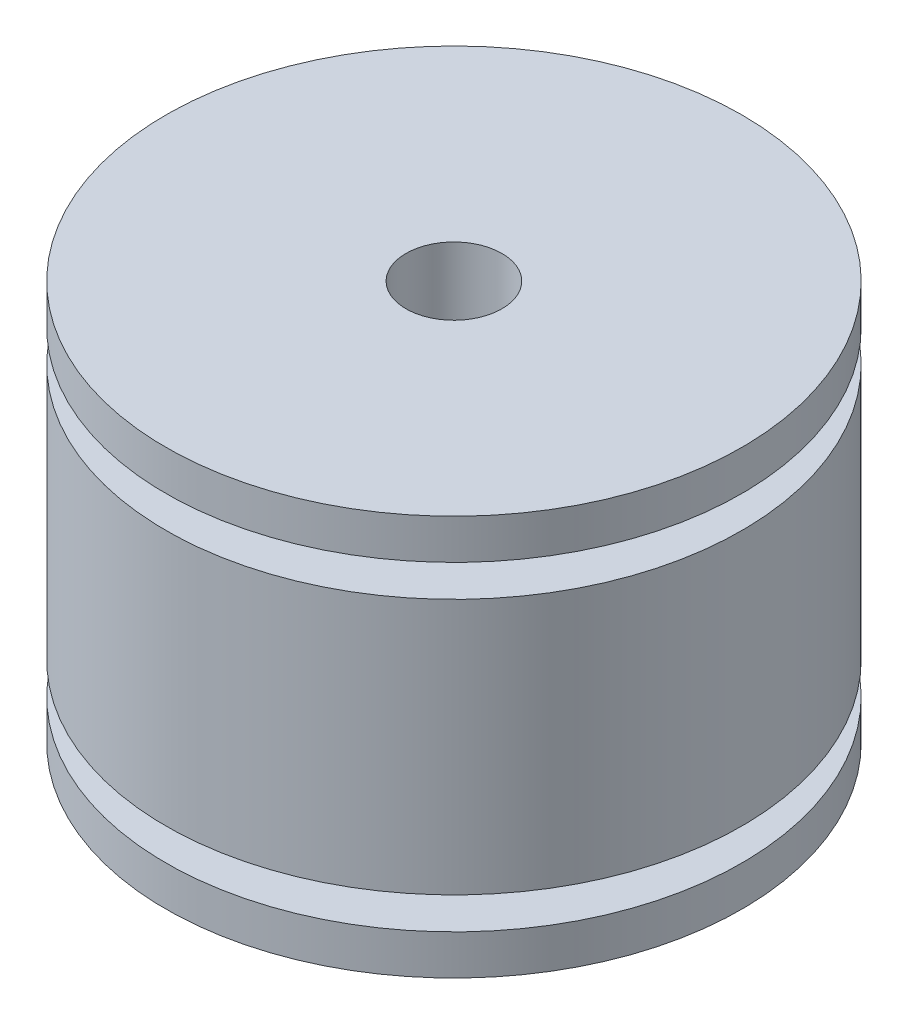
ISO-10303-21;
HEADER;
FILE_DESCRIPTION(('STEP AP214'),'2;1');
FILE_NAME('part.step','',(''),(''),'','','');
FILE_SCHEMA(('AUTOMOTIVE_DESIGN { 1 0 10303 214 1 1 1 1 }'));
ENDSEC;
DATA;
#1=APPLICATION_CONTEXT('core data for automotive mechanical design processes');
#2=APPLICATION_PROTOCOL_DEFINITION('international standard','automotive_design',2000,#1);
#3=PRODUCT_CONTEXT('',#1,'mechanical');
#4=PRODUCT('Part','Part','',(#3));
#5=PRODUCT_RELATED_PRODUCT_CATEGORY('part','',(#4));
#6=PRODUCT_DEFINITION_FORMATION('','',#4);
#7=PRODUCT_DEFINITION_CONTEXT('part definition',#1,'design');
#8=PRODUCT_DEFINITION('design','',#6,#7);
#9=PRODUCT_DEFINITION_SHAPE('','',#8);
#10=(LENGTH_UNIT() NAMED_UNIT(*) SI_UNIT(.MILLI.,.METRE.));
#11=(NAMED_UNIT(*) PLANE_ANGLE_UNIT() SI_UNIT($,.RADIAN.));
#12=(NAMED_UNIT(*) SI_UNIT($,.STERADIAN.) SOLID_ANGLE_UNIT());
#13=UNCERTAINTY_MEASURE_WITH_UNIT(LENGTH_MEASURE(1.E-05),#10,'distance_accuracy_value','');
#14=(GEOMETRIC_REPRESENTATION_CONTEXT(3) GLOBAL_UNCERTAINTY_ASSIGNED_CONTEXT((#13)) GLOBAL_UNIT_ASSIGNED_CONTEXT((#10,
#11,#12)) REPRESENTATION_CONTEXT('',''));
#15=CARTESIAN_POINT('',(0.,0.,0.));
#16=DIRECTION('',(0.,0.,1.));
#17=DIRECTION('',(1.,0.,0.));
#18=AXIS2_PLACEMENT_3D('',#15,#16,#17);
#19=CARTESIAN_POINT('',(10.,0.,0.));
#20=DIRECTION('',(0.,-1.,0.));
#21=DIRECTION('',(0.,0.,-1.));
#22=AXIS2_PLACEMENT_3D('',#19,#20,#21);
#23=PLANE('',#22);
#24=CARTESIAN_POINT('',(0.,0.,0.));
#25=DIRECTION('',(0.,-1.,0.));
#26=DIRECTION('',(0.,0.,-1.));
#27=AXIS2_PLACEMENT_3D('',#24,#25,#26);
#28=CIRCLE('',#27,18.);
#29=CARTESIAN_POINT('',(0.,0.,-18.));
#30=VERTEX_POINT('',#29);
#31=EDGE_CURVE('E10',#30,#30,#28,.T.);
#32=ORIENTED_EDGE('',*,*,#31,.T.);
#33=EDGE_LOOP('',(#32));
#34=FACE_BOUND('',#33,.T.);
#35=CARTESIAN_POINT('',(0.,0.,0.));
#36=DIRECTION('',(0.,-1.,0.));
#37=DIRECTION('',(0.,0.,-1.));
#38=AXIS2_PLACEMENT_3D('',#35,#36,#37);
#39=CIRCLE('',#38,3.);
#40=CARTESIAN_POINT('',(0.,0.,-3.));
#41=VERTEX_POINT('',#40);
#42=EDGE_CURVE('E76',#41,#41,#39,.T.);
#43=ORIENTED_EDGE('',*,*,#42,.F.);
#44=EDGE_LOOP('',(#43));
#45=FACE_BOUND('',#44,.T.);
#46=ADVANCED_FACE('F31',(#34,#45),#23,.T.);
#47=CARTESIAN_POINT('',(0.,0.,0.));
#48=DIRECTION('',(0.,-1.,0.));
#49=DIRECTION('',(0.,0.,-1.));
#50=AXIS2_PLACEMENT_3D('',#47,#48,#49);
#51=CYLINDRICAL_SURFACE('',#50,18.);
#52=CARTESIAN_POINT('',(0.,2.5,0.));
#53=DIRECTION('',(0.,-1.,0.));
#54=DIRECTION('',(0.,0.,-1.));
#55=AXIS2_PLACEMENT_3D('',#52,#53,#54);
#56=CIRCLE('',#55,18.);
#57=CARTESIAN_POINT('',(0.,2.5,-18.));
#58=VERTEX_POINT('',#57);
#59=EDGE_CURVE('E43',#58,#58,#56,.T.);
#60=ORIENTED_EDGE('',*,*,#59,.T.);
#61=EDGE_LOOP('',(#60));
#62=FACE_BOUND('',#61,.T.);
#63=ORIENTED_EDGE('',*,*,#31,.F.);
#64=EDGE_LOOP('',(#63));
#65=FACE_BOUND('',#64,.T.);
#66=ADVANCED_FACE('F124',(#62,#65),#51,.T.);
#67=CARTESIAN_POINT('',(18.,2.5,0.));
#68=DIRECTION('',(0.,1.,0.));
#69=DIRECTION('',(0.,0.,1.));
#70=AXIS2_PLACEMENT_3D('',#67,#68,#69);
#71=PLANE('',#70);
#72=CARTESIAN_POINT('',(0.,2.5,0.));
#73=DIRECTION('',(0.,-1.,0.));
#74=DIRECTION('',(0.,0.,-1.));
#75=AXIS2_PLACEMENT_3D('',#72,#73,#74);
#76=CIRCLE('',#75,15.);
#77=CARTESIAN_POINT('',(0.,2.5,-15.));
#78=VERTEX_POINT('',#77);
#79=EDGE_CURVE('E47',#78,#78,#76,.T.);
#80=ORIENTED_EDGE('',*,*,#79,.T.);
#81=EDGE_LOOP('',(#80));
#82=FACE_BOUND('',#81,.T.);
#83=ORIENTED_EDGE('',*,*,#59,.F.);
#84=EDGE_LOOP('',(#83));
#85=FACE_BOUND('',#84,.T.);
#86=ADVANCED_FACE('F128',(#82,#85),#71,.T.);
#87=CARTESIAN_POINT('',(0.,0.,0.));
#88=DIRECTION('',(0.,-1.,0.));
#89=DIRECTION('',(0.,0.,-1.));
#90=AXIS2_PLACEMENT_3D('',#87,#88,#89);
#91=CYLINDRICAL_SURFACE('',#90,15.);
#92=CARTESIAN_POINT('',(0.,4.5,0.));
#93=DIRECTION('',(0.,-1.,0.));
#94=DIRECTION('',(0.,0.,-1.));
#95=AXIS2_PLACEMENT_3D('',#92,#93,#94);
#96=CIRCLE('',#95,15.);
#97=CARTESIAN_POINT('',(0.,4.5,-15.));
#98=VERTEX_POINT('',#97);
#99=EDGE_CURVE('E52',#98,#98,#96,.T.);
#100=ORIENTED_EDGE('',*,*,#99,.T.);
#101=EDGE_LOOP('',(#100));
#102=FACE_BOUND('',#101,.T.);
#103=ORIENTED_EDGE('',*,*,#79,.F.);
#104=EDGE_LOOP('',(#103));
#105=FACE_BOUND('',#104,.T.);
#106=ADVANCED_FACE('F146',(#102,#105),#91,.T.);
#107=CARTESIAN_POINT('',(15.,4.5,0.));
#108=DIRECTION('',(0.,-1.,0.));
#109=DIRECTION('',(0.,0.,-1.));
#110=AXIS2_PLACEMENT_3D('',#107,#108,#109);
#111=PLANE('',#110);
#112=CARTESIAN_POINT('',(0.,4.5,0.));
#113=DIRECTION('',(0.,-1.,0.));
#114=DIRECTION('',(0.,0.,-1.));
#115=AXIS2_PLACEMENT_3D('',#112,#113,#114);
#116=CIRCLE('',#115,18.);
#117=CARTESIAN_POINT('',(0.,4.5,-18.));
#118=VERTEX_POINT('',#117);
#119=EDGE_CURVE('E55',#118,#118,#116,.T.);
#120=ORIENTED_EDGE('',*,*,#119,.T.);
#121=EDGE_LOOP('',(#120));
#122=FACE_BOUND('',#121,.T.);
#123=ORIENTED_EDGE('',*,*,#99,.F.);
#124=EDGE_LOOP('',(#123));
#125=FACE_BOUND('',#124,.T.);
#126=ADVANCED_FACE('F120',(#122,#125),#111,.T.);
#127=CARTESIAN_POINT('',(0.,0.,0.));
#128=DIRECTION('',(0.,-1.,0.));
#129=DIRECTION('',(0.,0.,-1.));
#130=AXIS2_PLACEMENT_3D('',#127,#128,#129);
#131=CYLINDRICAL_SURFACE('',#130,18.);
#132=CARTESIAN_POINT('',(0.,14.15,-18.));
#133=CARTESIAN_POINT('',(0.0924730089777942,14.1499959769229,-17.9999990165203));
#134=CARTESIAN_POINT('',(0.185008104730828,14.1421999689901,-17.9992798102664));
#135=CARTESIAN_POINT('',(0.367515566690616,14.1112163313321,-17.9964799073167));
#136=CARTESIAN_POINT('',(0.457484950248261,14.0880114932179,-17.9943976884625));
#137=CARTESIAN_POINT('',(0.632191476383594,14.0268890336256,-17.9891069391612));
#138=CARTESIAN_POINT('',(0.716931641484837,13.9889800053683,-17.9858990666574));
#139=CARTESIAN_POINT('',(0.878826742100969,13.8995412739189,-17.9787162542032));
#140=CARTESIAN_POINT('',(0.955983240991005,13.8480143861664,-17.974741472854));
#141=CARTESIAN_POINT('',(1.10077560657444,13.7326334206667,-17.9664569369258));
#142=CARTESIAN_POINT('',(1.16838511785454,13.6687463293758,-17.9621463041436));
#143=CARTESIAN_POINT('',(1.29193798854142,13.5305285993611,-17.9536832174252));
#144=CARTESIAN_POINT('',(1.34788082274475,13.4561974907268,-17.949530770617));
#145=CARTESIAN_POINT('',(1.44660370199867,13.2990393214029,-17.9418450219315));
#146=CARTESIAN_POINT('',(1.48936022711766,13.2161974270791,-17.9383128311575));
#147=CARTESIAN_POINT('',(1.56034658154229,13.0444723874368,-17.9322780253021));
#148=CARTESIAN_POINT('',(1.58857671610169,12.9555893691094,-17.9297753885862));
#149=CARTESIAN_POINT('',(1.62963160964261,12.7745717373105,-17.9260907305027));
#150=CARTESIAN_POINT('',(1.64249971968177,12.6824470327677,-17.9249049935563));
#151=CARTESIAN_POINT('',(1.65259924969731,12.4973383448704,-17.9239767574574));
#152=CARTESIAN_POINT('',(1.64983101916567,12.4043543807678,-17.9242342260474));
#153=CARTESIAN_POINT('',(1.62877222799281,12.2204645629944,-17.9261599247296));
#154=CARTESIAN_POINT('',(1.61052888543495,12.129553250739,-17.9278238633078));
#155=CARTESIAN_POINT('',(1.5591111435692,11.9520883842742,-17.9323683015302));
#156=CARTESIAN_POINT('',(1.52593657166761,11.8655348804506,-17.9352488152371));
#157=CARTESIAN_POINT('',(1.44554556512932,11.699092718202,-17.9419067839707));
#158=CARTESIAN_POINT('',(1.39830805841616,11.6192142934759,-17.9456855832753));
#159=CARTESIAN_POINT('',(1.29114724803043,11.468501691361,-17.9537131604606));
#160=CARTESIAN_POINT('',(1.23122363277873,11.3976677361788,-17.9579619498833));
#161=CARTESIAN_POINT('',(1.1001273129707,11.266780319895,-17.9664698862705));
#162=CARTESIAN_POINT('',(1.02891380778703,11.2067677156597,-17.9707290133932));
#163=CARTESIAN_POINT('',(0.877401221334841,11.0995428052532,-17.9787628190883));
#164=CARTESIAN_POINT('',(0.79710213218257,11.0523305101894,-17.9825374972404));
#165=CARTESIAN_POINT('',(0.629670380868843,10.972048513261,-17.9891780608739));
#166=CARTESIAN_POINT('',(0.54253678551895,10.9389807466924,-17.9920438219807));
#167=CARTESIAN_POINT('',(0.363922165797386,10.8879557226478,-17.9965423154456));
#168=CARTESIAN_POINT('',(0.272441250685663,10.8699980856251,-17.998175078775));
#169=CARTESIAN_POINT('',(0.0880827863778501,10.8497545867551,-18.0000196334979));
#170=CARTESIAN_POINT('',(-0.00478851994213631,10.8474123170602,-18.0002365393753));
#171=CARTESIAN_POINT('',(-0.189602426343213,10.8583180886282,-17.9992386256883));
#172=CARTESIAN_POINT('',(-0.281545036924917,10.8715659534166,-17.9980238223304));
#173=CARTESIAN_POINT('',(-0.461729859832482,10.9132291616272,-17.9943023380432));
#174=CARTESIAN_POINT('',(-0.549978197199529,10.9416182322862,-17.9917978951337));
#175=CARTESIAN_POINT('',(-0.720459473285441,11.0127310777251,-17.9857782895889));
#176=CARTESIAN_POINT('',(-0.802692297702625,11.0554551247998,-17.9822631077548));
#177=CARTESIAN_POINT('',(-0.95906416907009,11.1541660084034,-17.9746029160205));
#178=CARTESIAN_POINT('',(-1.03317963196582,11.2101900669848,-17.9704561504294));
#179=CARTESIAN_POINT('',(-1.1709745314144,11.333857078405,-17.9620041665241));
#180=CARTESIAN_POINT('',(-1.23465374831271,11.4015002757338,-17.957698944877));
#181=CARTESIAN_POINT('',(-1.34996315741374,11.5467308468094,-17.949400012585));
#182=CARTESIAN_POINT('',(-1.40155643872762,11.6243475905938,-17.9454072803958));
#183=CARTESIAN_POINT('',(-1.49097603562296,11.7871764464673,-17.9381997831991));
#184=CARTESIAN_POINT('',(-1.52880251317026,11.8723884691836,-17.9349850090391));
#185=CARTESIAN_POINT('',(-1.58955238811465,12.0478602957559,-17.9297032329055));
#186=CARTESIAN_POINT('',(-1.61249807785267,12.1381123280263,-17.92763451475));
#187=CARTESIAN_POINT('',(-1.64290749640671,12.3212079635485,-17.9248735504127));
#188=CARTESIAN_POINT('',(-1.65037159227185,12.414051505306,-17.9241812715973));
#189=CARTESIAN_POINT('',(-1.64960130290758,12.5993278408646,-17.9242521515633));
#190=CARTESIAN_POINT('',(-1.6414249053268,12.6917608833087,-17.9250099341974));
#191=CARTESIAN_POINT('',(-1.60972696209246,12.8739347371242,-17.9278841128356));
#192=CARTESIAN_POINT('',(-1.5862053957551,12.9636755448666,-17.930000510671));
#193=CARTESIAN_POINT('',(-1.52450013860204,13.1379192438524,-17.9353520050897));
#194=CARTESIAN_POINT('',(-1.48631781481989,13.2224226226037,-17.9385869973675));
#195=CARTESIAN_POINT('',(-1.39638110313423,13.3838298321565,-17.9458113807868));
#196=CARTESIAN_POINT('',(-1.34462686256732,13.4607337454452,-17.9498007637386));
#197=CARTESIAN_POINT('',(-1.22879741420244,13.6050560796418,-17.9581020915792));
#198=CARTESIAN_POINT('',(-1.1646791015938,13.6724398430915,-17.9624151317202));
#199=CARTESIAN_POINT('',(-1.02602387521056,13.7955189222297,-17.9708677751142));
#200=CARTESIAN_POINT('',(-0.951484456637272,13.8512114197515,-17.9750073363584));
#201=CARTESIAN_POINT('',(-0.793930194119728,13.9494184651077,-17.9826556537042));
#202=CARTESIAN_POINT('',(-0.710897299477316,13.9919041380394,-17.9861630206682));
#203=CARTESIAN_POINT('',(-0.538899037117384,14.0622748268118,-17.9921361218513));
#204=CARTESIAN_POINT('',(-0.449940557540237,14.0901764729629,-17.9946030418795));
#205=CARTESIAN_POINT('',(-0.300389365833146,14.1235518796562,-17.9975903967111));
#206=CARTESIAN_POINT('',(-0.240755770046248,14.133456567057,-17.9984898367725));
#207=CARTESIAN_POINT('',(-0.120756941332191,14.1466819299447,-17.9996949585704));
#208=CARTESIAN_POINT('',(-0.0603917108432152,14.1500026273667,-18.0000006422849));
#209=CARTESIAN_POINT('',(0.,14.15,-18.));
#210=B_SPLINE_CURVE_WITH_KNOTS('',3,(#132,#133,#134,#135,#136,#137,#138,#139,#140,#141,#142,
#143,#144,#145,#146,#147,#148,#149,#150,#151,#152,#153,#154,#155,#156,#157,#158,#159,#160,#161,
#162,#163,#164,#165,#166,#167,#168,#169,#170,#171,#172,#173,#174,#175,#176,#177,#178,#179,#180,
#181,#182,#183,#184,#185,#186,#187,#188,#189,#190,#191,#192,#193,#194,#195,#196,#197,#198,#199,
#200,#201,#202,#203,#204,#205,#206,#207,#208,#209),.UNSPECIFIED.,.T.,.F.,(4,2,2,2,2,2,2,2,2,2,2,
2,2,2,2,2,2,2,2,2,2,2,2,2,2,2,2,2,2,2,2,2,2,2,2,2,2,2,4),(0.,0.277198515960827,
0.554707125579579,0.832053801183602,1.10934318123555,1.38738367666351,1.66543668605063,
1.94398281762033,2.22252309565563,2.50027547125709,2.77802163876646,3.05492337540341,
3.33182831289695,3.60915027463479,3.88647904837219,4.16483392192147,4.44318903700727,
4.72158222528574,4.99996842048417,5.27734844563559,5.55472533097676,5.83162247508419,
6.10852487919072,6.38621156637364,6.66390409735454,6.94243396559235,7.22096055683259,
7.49906892823084,7.77717070595404,8.05424341017449,8.33131648786286,8.60836373630959,
8.88540797725864,9.16343613340507,9.44153123116746,9.72023013724703,9.99861054303657,
10.1796422687253,10.3606733912888),.UNSPECIFIED.);
#211=CARTESIAN_POINT('',(0.,14.15,-18.));
#212=VERTEX_POINT('',#211);
#213=EDGE_CURVE('E79',#212,#212,#210,.T.);
#214=ORIENTED_EDGE('',*,*,#213,.F.);
#215=EDGE_LOOP('',(#214));
#216=FACE_BOUND('',#215,.T.);
#217=CARTESIAN_POINT('',(0.,20.5,0.));
#218=DIRECTION('',(0.,-1.,0.));
#219=DIRECTION('',(0.,0.,-1.));
#220=AXIS2_PLACEMENT_3D('',#217,#218,#219);
#221=CIRCLE('',#220,18.);
#222=CARTESIAN_POINT('',(0.,20.5,-18.));
#223=VERTEX_POINT('',#222);
#224=EDGE_CURVE('E58',#223,#223,#221,.T.);
#225=ORIENTED_EDGE('',*,*,#224,.T.);
#226=EDGE_LOOP('',(#225));
#227=FACE_BOUND('',#226,.T.);
#228=ORIENTED_EDGE('',*,*,#119,.F.);
#229=EDGE_LOOP('',(#228));
#230=FACE_BOUND('',#229,.T.);
#231=ADVANCED_FACE('F85',(#216,#227,#230),#131,.T.);
#232=CARTESIAN_POINT('',(18.,20.5,0.));
#233=DIRECTION('',(0.,1.,0.));
#234=DIRECTION('',(0.,0.,1.));
#235=AXIS2_PLACEMENT_3D('',#232,#233,#234);
#236=PLANE('',#235);
#237=CARTESIAN_POINT('',(0.,20.5,0.));
#238=DIRECTION('',(0.,-1.,0.));
#239=DIRECTION('',(0.,0.,-1.));
#240=AXIS2_PLACEMENT_3D('',#237,#238,#239);
#241=CIRCLE('',#240,15.);
#242=CARTESIAN_POINT('',(0.,20.5,-15.));
#243=VERTEX_POINT('',#242);
#244=EDGE_CURVE('E61',#243,#243,#241,.T.);
#245=ORIENTED_EDGE('',*,*,#244,.T.);
#246=EDGE_LOOP('',(#245));
#247=FACE_BOUND('',#246,.T.);
#248=ORIENTED_EDGE('',*,*,#224,.F.);
#249=EDGE_LOOP('',(#248));
#250=FACE_BOUND('',#249,.T.);
#251=ADVANCED_FACE('F113',(#247,#250),#236,.T.);
#252=CARTESIAN_POINT('',(0.,0.,0.));
#253=DIRECTION('',(0.,-1.,0.));
#254=DIRECTION('',(0.,0.,-1.));
#255=AXIS2_PLACEMENT_3D('',#252,#253,#254);
#256=CYLINDRICAL_SURFACE('',#255,15.);
#257=CARTESIAN_POINT('',(0.,22.5,0.));
#258=DIRECTION('',(0.,-1.,0.));
#259=DIRECTION('',(0.,0.,-1.));
#260=AXIS2_PLACEMENT_3D('',#257,#258,#259);
#261=CIRCLE('',#260,15.);
#262=CARTESIAN_POINT('',(0.,22.5,-15.));
#263=VERTEX_POINT('',#262);
#264=EDGE_CURVE('E64',#263,#263,#261,.T.);
#265=ORIENTED_EDGE('',*,*,#264,.T.);
#266=EDGE_LOOP('',(#265));
#267=FACE_BOUND('',#266,.T.);
#268=ORIENTED_EDGE('',*,*,#244,.F.);
#269=EDGE_LOOP('',(#268));
#270=FACE_BOUND('',#269,.T.);
#271=ADVANCED_FACE('F110',(#267,#270),#256,.T.);
#272=CARTESIAN_POINT('',(15.,22.5,0.));
#273=DIRECTION('',(0.,-1.,0.));
#274=DIRECTION('',(0.,0.,-1.));
#275=AXIS2_PLACEMENT_3D('',#272,#273,#274);
#276=PLANE('',#275);
#277=CARTESIAN_POINT('',(0.,22.5,0.));
#278=DIRECTION('',(0.,-1.,0.));
#279=DIRECTION('',(0.,0.,-1.));
#280=AXIS2_PLACEMENT_3D('',#277,#278,#279);
#281=CIRCLE('',#280,18.);
#282=CARTESIAN_POINT('',(0.,22.5,-18.));
#283=VERTEX_POINT('',#282);
#284=EDGE_CURVE('E67',#283,#283,#281,.T.);
#285=ORIENTED_EDGE('',*,*,#284,.T.);
#286=EDGE_LOOP('',(#285));
#287=FACE_BOUND('',#286,.T.);
#288=ORIENTED_EDGE('',*,*,#264,.F.);
#289=EDGE_LOOP('',(#288));
#290=FACE_BOUND('',#289,.T.);
#291=ADVANCED_FACE('F106',(#287,#290),#276,.T.);
#292=CARTESIAN_POINT('',(0.,0.,0.));
#293=DIRECTION('',(0.,-1.,0.));
#294=DIRECTION('',(0.,0.,-1.));
#295=AXIS2_PLACEMENT_3D('',#292,#293,#294);
#296=CYLINDRICAL_SURFACE('',#295,18.);
#297=CARTESIAN_POINT('',(0.,25.,0.));
#298=DIRECTION('',(0.,-1.,0.));
#299=DIRECTION('',(0.,0.,-1.));
#300=AXIS2_PLACEMENT_3D('',#297,#298,#299);
#301=CIRCLE('',#300,18.);
#302=CARTESIAN_POINT('',(0.,25.,-18.));
#303=VERTEX_POINT('',#302);
#304=EDGE_CURVE('E70',#303,#303,#301,.T.);
#305=ORIENTED_EDGE('',*,*,#304,.T.);
#306=EDGE_LOOP('',(#305));
#307=FACE_BOUND('',#306,.T.);
#308=ORIENTED_EDGE('',*,*,#284,.F.);
#309=EDGE_LOOP('',(#308));
#310=FACE_BOUND('',#309,.T.);
#311=ADVANCED_FACE('F102',(#307,#310),#296,.T.);
#312=CARTESIAN_POINT('',(18.,25.,0.));
#313=DIRECTION('',(0.,1.,0.));
#314=DIRECTION('',(0.,0.,1.));
#315=AXIS2_PLACEMENT_3D('',#312,#313,#314);
#316=PLANE('',#315);
#317=CARTESIAN_POINT('',(0.,25.,0.));
#318=DIRECTION('',(0.,-1.,0.));
#319=DIRECTION('',(0.,0.,-1.));
#320=AXIS2_PLACEMENT_3D('',#317,#318,#319);
#321=CIRCLE('',#320,3.);
#322=CARTESIAN_POINT('',(0.,25.,-3.));
#323=VERTEX_POINT('',#322);
#324=EDGE_CURVE('E73',#323,#323,#321,.T.);
#325=ORIENTED_EDGE('',*,*,#324,.T.);
#326=EDGE_LOOP('',(#325));
#327=FACE_BOUND('',#326,.T.);
#328=ORIENTED_EDGE('',*,*,#304,.F.);
#329=EDGE_LOOP('',(#328));
#330=FACE_BOUND('',#329,.T.);
#331=ADVANCED_FACE('F98',(#327,#330),#316,.T.);
#332=CARTESIAN_POINT('',(0.,0.,0.));
#333=DIRECTION('',(0.,-1.,0.));
#334=DIRECTION('',(0.,0.,-1.));
#335=AXIS2_PLACEMENT_3D('',#332,#333,#334);
#336=CYLINDRICAL_SURFACE('',#335,3.);
#337=CARTESIAN_POINT('',(0.,14.15,-3.));
#338=CARTESIAN_POINT('',(-0.0856699475452996,14.1499946166217,-2.99999513886583));
#339=CARTESIAN_POINT('',(-0.171409071205646,14.143289354409,-2.99629302255545));
#340=CARTESIAN_POINT('',(-0.340286051726048,14.1167977847696,-2.9818478399119));
#341=CARTESIAN_POINT('',(-0.423420195379861,14.096993621652,-2.97109516282084));
#342=CARTESIAN_POINT('',(-0.584401577928638,14.0453455356783,-2.9436571869529));
#343=CARTESIAN_POINT('',(-0.66226906266742,14.0135512213703,-2.92699634956489));
#344=CARTESIAN_POINT('',(-0.811408240635764,13.9391213318261,-2.8892116252981));
#345=CARTESIAN_POINT('',(-0.882679651896675,13.8964852934199,-2.86808754775153));
#346=CARTESIAN_POINT('',(-1.02211619357275,13.7982846668754,-2.82153252993505));
#347=CARTESIAN_POINT('',(-1.08973037342791,13.7420324755559,-2.79590528013301));
#348=CARTESIAN_POINT('',(-1.21508634233517,13.6197083915399,-2.74375354722835));
#349=CARTESIAN_POINT('',(-1.2728189023456,13.5536274256305,-2.71722825277821));
#350=CARTESIAN_POINT('',(-1.38251917690996,13.4057740140773,-2.66321895829991));
#351=CARTESIAN_POINT('',(-1.43335857713387,13.3230970385153,-2.635897965792));
#352=CARTESIAN_POINT('',(-1.52021547735939,13.1487726343674,-2.58678336476683));
#353=CARTESIAN_POINT('',(-1.5562446891168,13.0571323651428,-2.56498539395023));
#354=CARTESIAN_POINT('',(-1.60989890926138,12.8732305515727,-2.53163475086558));
#355=CARTESIAN_POINT('',(-1.62854263347079,12.7813738465472,-2.51952192354843));
#356=CARTESIAN_POINT('',(-1.64991120631134,12.5951105514433,-2.5055890563389));
#357=CARTESIAN_POINT('',(-1.65265887915297,12.500707812976,-2.50375425894471));
#358=CARTESIAN_POINT('',(-1.64290000078864,12.3275716432504,-2.51015646726158));
#359=CARTESIAN_POINT('',(-1.63265157443424,12.2486402415007,-2.51690299364892));
#360=CARTESIAN_POINT('',(-1.60118639026894,12.0938705800967,-2.53703527550373));
#361=CARTESIAN_POINT('',(-1.5799646365691,12.0180337463059,-2.55042405491467));
#362=CARTESIAN_POINT('',(-1.52687641342515,11.8695176799991,-2.58256130946142));
#363=CARTESIAN_POINT('',(-1.49479033069661,11.7969417622077,-2.60141910516922));
#364=CARTESIAN_POINT('',(-1.42107429999088,11.6578289794032,-2.64240902469132));
#365=CARTESIAN_POINT('',(-1.37944023253661,11.5912947384181,-2.66454256035721));
#366=CARTESIAN_POINT('',(-1.28018349411555,11.4551052164199,-2.71379040847906));
#367=CARTESIAN_POINT('',(-1.22107458392543,11.3866139481156,-2.74113957142577));
#368=CARTESIAN_POINT('',(-1.09224532196501,11.2599734193486,-2.79497377887706));
#369=CARTESIAN_POINT('',(-1.02251777065964,11.2018312341076,-2.82145822218593));
#370=CARTESIAN_POINT('',(-0.868605041800935,11.0937851733166,-2.87272134052732));
#371=CARTESIAN_POINT('',(-0.783763861453041,11.0446953593711,-2.89726648156192));
#372=CARTESIAN_POINT('',(-0.605352377645231,10.9619192465625,-2.93971528365153));
#373=CARTESIAN_POINT('',(-0.511790381195992,10.9282184658333,-2.95762518579738));
#374=CARTESIAN_POINT('',(-0.327907037980977,10.8803877895618,-2.98333345624201));
#375=CARTESIAN_POINT('',(-0.238095480523288,10.8647274484825,-2.99191822782612));
#376=CARTESIAN_POINT('',(-0.0567325334425125,10.8484691712931,-3.00083376662002));
#377=CARTESIAN_POINT('',(0.0348177069344353,10.8478616100382,-3.00116980828416));
#378=CARTESIAN_POINT('',(0.207487375150858,10.8610345133055,-2.99394177831786));
#379=CARTESIAN_POINT('',(0.28875177623744,10.8734146012818,-2.98714659587173));
#380=CARTESIAN_POINT('',(0.447838849624849,10.9098425973326,-2.96746793830126));
#381=CARTESIAN_POINT('',(0.525661172937912,10.9338916855665,-2.95458384737082));
#382=CARTESIAN_POINT('',(0.677753407865904,10.9933576159517,-2.92349378037743));
#383=CARTESIAN_POINT('',(0.751904240945378,11.0290176955469,-2.90517475144826));
#384=CARTESIAN_POINT('',(0.893363199749704,11.1103713462997,-2.86484215103297));
#385=CARTESIAN_POINT('',(0.960668811424108,11.1560685844836,-2.8428272299655));
#386=CARTESIAN_POINT('',(1.09455456288909,11.2620447141384,-2.79420331593949));
#387=CARTESIAN_POINT('',(1.16021004375818,11.323383283659,-2.76735592347542));
#388=CARTESIAN_POINT('',(1.28079913012788,11.4559244296775,-2.71365440736755));
#389=CARTESIAN_POINT('',(1.33572155748717,11.5271371592824,-2.6868003055646));
#390=CARTESIAN_POINT('',(1.43747254066661,11.6841641934071,-2.63385875511374));
#391=CARTESIAN_POINT('',(1.48334076829298,11.7706830768754,-2.60799295737883));
#392=CARTESIAN_POINT('',(1.55942876653783,11.9519940797087,-2.56323063992907));
#393=CARTESIAN_POINT('',(1.58967133039468,12.0467739113999,-2.54432398053561));
#394=CARTESIAN_POINT('',(1.6306246255404,12.2322623775855,-2.51825420457375));
#395=CARTESIAN_POINT('',(1.64294477567078,12.3224747805395,-2.51013022153208));
#396=CARTESIAN_POINT('',(1.65249034912289,12.504010469288,-2.50386093509844));
#397=CARTESIAN_POINT('',(1.64972872967261,12.5953327342726,-2.50570706604924));
#398=CARTESIAN_POINT('',(1.63075691736925,12.7632195215555,-2.51807870697285));
#399=CARTESIAN_POINT('',(1.61642825416935,12.8401009735331,-2.52738874118223));
#400=CARTESIAN_POINT('',(1.57741079979876,12.99019541896,-2.55192145753237));
#401=CARTESIAN_POINT('',(1.55271775279779,13.0634068916,-2.56714656833463));
#402=CARTESIAN_POINT('',(1.492056117962,13.209139646293,-2.60289749299613));
#403=CARTESIAN_POINT('',(1.45548954002739,13.2813439958992,-2.62369085726804));
#404=CARTESIAN_POINT('',(1.37268509596929,13.4190760215003,-2.66794671801683));
#405=CARTESIAN_POINT('',(1.32644209751913,13.4846001267867,-2.69141062791391));
#406=CARTESIAN_POINT('',(1.21715006880685,13.6178497395553,-2.74276036037727));
#407=CARTESIAN_POINT('',(1.15260264369496,13.6843082351833,-2.77076245736401));
#408=CARTESIAN_POINT('',(1.01279351012944,13.8058844274221,-2.82486614857147));
#409=CARTESIAN_POINT('',(0.937524174112384,13.860993981549,-2.85096636964491));
#410=CARTESIAN_POINT('',(0.774887264813825,13.9599380339659,-2.89948189270181));
#411=CARTESIAN_POINT('',(0.687189892415589,14.0033135644064,-2.92173740350452));
#412=CARTESIAN_POINT('',(0.504223640414893,14.0741097143308,-2.95878417900051));
#413=CARTESIAN_POINT('',(0.40897489894885,14.1015712477707,-2.97359457153256));
#414=CARTESIAN_POINT('',(0.260510618519072,14.1301420580123,-2.98911434756595));
#415=CARTESIAN_POINT('',(0.208783056433921,14.1375724320123,-2.99318008334623));
#416=CARTESIAN_POINT('',(0.104712273399592,14.1475030128209,-2.99862437594613));
#417=CARTESIAN_POINT('',(0.0523690613485742,14.1500032907977,-3.00000297155585));
#418=CARTESIAN_POINT('',(0.,14.15,-3.));
#419=B_SPLINE_CURVE_WITH_KNOTS('',3,(#337,#338,#339,#340,#341,#342,#343,#344,#345,#346,#347,
#348,#349,#350,#351,#352,#353,#354,#355,#356,#357,#358,#359,#360,#361,#362,#363,#364,#365,#366,
#367,#368,#369,#370,#371,#372,#373,#374,#375,#376,#377,#378,#379,#380,#381,#382,#383,#384,#385,
#386,#387,#388,#389,#390,#391,#392,#393,#394,#395,#396,#397,#398,#399,#400,#401,#402,#403,#404,
#405,#406,#407,#408,#409,#410,#411,#412,#413,#414,#415,#416,#417,#418),.UNSPECIFIED.,.T.,.F.,(4,
2,2,2,2,2,2,2,2,2,2,2,2,2,2,2,2,2,2,2,2,2,2,2,2,2,2,2,2,2,2,2,2,2,2,2,2,2,2,2,4),(0.,
0.256799016537927,0.513948810602824,0.770046131883809,1.02615439574976,1.29988051794782,
1.57386091081864,1.87483382859252,2.17556827984511,2.45730761481344,2.7386423161532,
2.97715628850379,3.21577894619804,3.45954576386221,3.70341795322454,3.98576982265922,
4.26831398861797,4.56980790280871,4.87101750814851,5.14417314031287,5.41715410504554,
5.66345591892143,5.90978264803878,6.16164305576709,6.41359563296035,6.69375293580822,
6.97420047673716,7.27643629132653,7.57822997932258,7.85076329691248,8.12306250931444,
8.35830132419629,8.59363682764366,8.84338665158087,9.09326927891542,9.38234984684169,
9.67163710326651,9.97098879991469,10.2695674268337,10.4265480013941,10.5835263098519),.UNSPECIFIED.);
#420=CARTESIAN_POINT('',(0.,14.15,-3.));
#421=VERTEX_POINT('',#420);
#422=EDGE_CURVE('E34',#421,#421,#419,.T.);
#423=ORIENTED_EDGE('',*,*,#422,.F.);
#424=EDGE_LOOP('',(#423));
#425=FACE_BOUND('',#424,.T.);
#426=ORIENTED_EDGE('',*,*,#42,.T.);
#427=EDGE_LOOP('',(#426));
#428=FACE_BOUND('',#427,.T.);
#429=ORIENTED_EDGE('',*,*,#324,.F.);
#430=EDGE_LOOP('',(#429));
#431=FACE_BOUND('',#430,.T.);
#432=ADVANCED_FACE('F92',(#425,#428,#431),#336,.F.);
#433=CARTESIAN_POINT('',(0.,12.5,-18.));
#434=DIRECTION('',(0.,0.,1.));
#435=DIRECTION('',(1.,0.,0.));
#436=AXIS2_PLACEMENT_3D('',#433,#434,#435);
#437=CYLINDRICAL_SURFACE('',#436,1.65);
#438=ORIENTED_EDGE('',*,*,#213,.T.);
#439=EDGE_LOOP('',(#438));
#440=FACE_BOUND('',#439,.T.);
#441=ORIENTED_EDGE('',*,*,#422,.T.);
#442=EDGE_LOOP('',(#441));
#443=FACE_BOUND('',#442,.T.);
#444=ADVANCED_FACE('F89',(#440,#443),#437,.F.);
#445=CLOSED_SHELL('',(#46,#66,#86,#106,#126,#231,#251,#271,#291,#311,#331,#432,#444));
#446=MANIFOLD_SOLID_BREP('B2',#445);
#447=ADVANCED_BREP_SHAPE_REPRESENTATION('',(#18,#446),#14);
#448=SHAPE_DEFINITION_REPRESENTATION(#9,#447);
ENDSEC;
END-ISO-10303-21;
